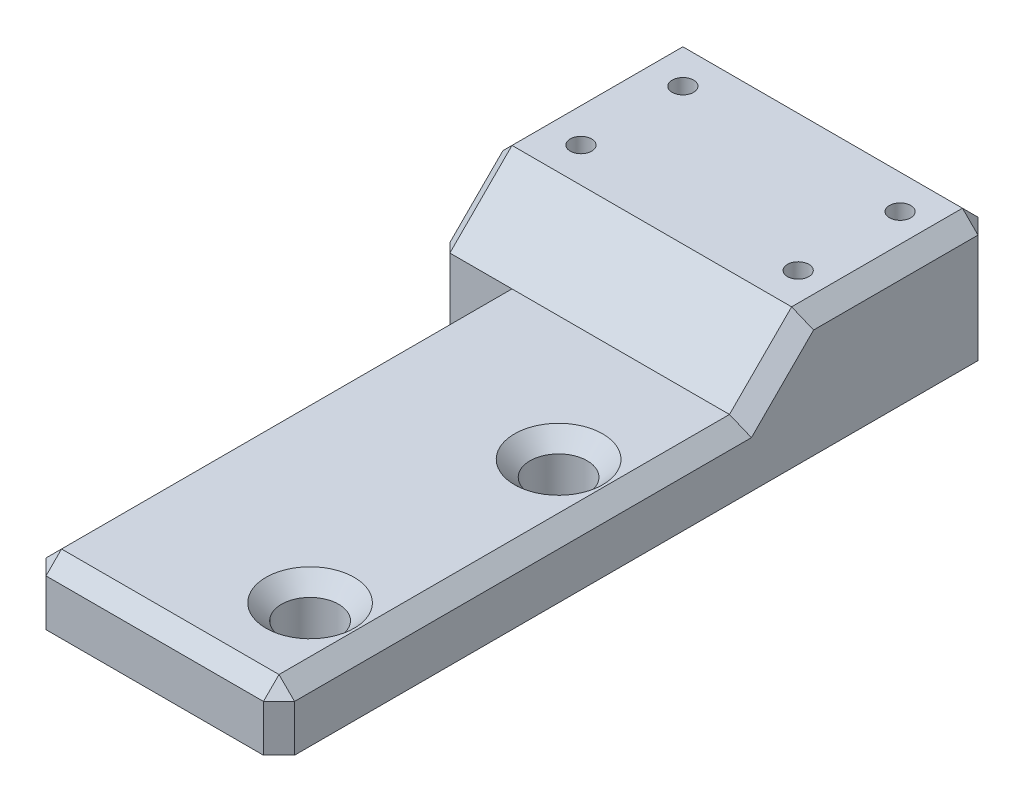
ISO-10303-21;
HEADER;
FILE_DESCRIPTION(('STEP AP214'),'2;1');
FILE_NAME('part.step','',(''),(''),'','','');
FILE_SCHEMA(('AUTOMOTIVE_DESIGN { 1 0 10303 214 1 1 1 1 }'));
ENDSEC;
DATA;
#1=APPLICATION_CONTEXT('core data for automotive mechanical design processes');
#2=APPLICATION_PROTOCOL_DEFINITION('international standard','automotive_design',2000,#1);
#3=PRODUCT_CONTEXT('',#1,'mechanical');
#4=PRODUCT('Part','Part','',(#3));
#5=PRODUCT_RELATED_PRODUCT_CATEGORY('part','',(#4));
#6=PRODUCT_DEFINITION_FORMATION('','',#4);
#7=PRODUCT_DEFINITION_CONTEXT('part definition',#1,'design');
#8=PRODUCT_DEFINITION('design','',#6,#7);
#9=PRODUCT_DEFINITION_SHAPE('','',#8);
#10=(LENGTH_UNIT() NAMED_UNIT(*) SI_UNIT(.MILLI.,.METRE.));
#11=(NAMED_UNIT(*) PLANE_ANGLE_UNIT() SI_UNIT($,.RADIAN.));
#12=(NAMED_UNIT(*) SI_UNIT($,.STERADIAN.) SOLID_ANGLE_UNIT());
#13=UNCERTAINTY_MEASURE_WITH_UNIT(LENGTH_MEASURE(1.E-05),#10,'distance_accuracy_value','');
#14=(GEOMETRIC_REPRESENTATION_CONTEXT(3) GLOBAL_UNCERTAINTY_ASSIGNED_CONTEXT((#13)) GLOBAL_UNIT_ASSIGNED_CONTEXT((#10,
#11,#12)) REPRESENTATION_CONTEXT('',''));
#15=CARTESIAN_POINT('',(0.,0.,0.));
#16=DIRECTION('',(0.,0.,1.));
#17=DIRECTION('',(1.,0.,0.));
#18=AXIS2_PLACEMENT_3D('',#15,#16,#17);
#19=CARTESIAN_POINT('',(0.,12.7,0.));
#20=DIRECTION('',(0.,-1.,0.));
#21=DIRECTION('',(0.,0.,-1.));
#22=AXIS2_PLACEMENT_3D('',#19,#20,#21);
#23=PLANE('',#22);
#24=CARTESIAN_POINT('',(5.08,12.7,-67.945));
#25=DIRECTION('',(0.,-1.,0.));
#26=DIRECTION('',(0.,0.,-1.));
#27=AXIS2_PLACEMENT_3D('',#24,#25,#26);
#28=CIRCLE('',#27,1.09219999999999);
#29=CARTESIAN_POINT('',(5.08,12.7,-69.0372));
#30=VERTEX_POINT('',#29);
#31=EDGE_CURVE('E203',#30,#30,#28,.T.);
#32=ORIENTED_EDGE('',*,*,#31,.T.);
#33=EDGE_LOOP('',(#32));
#34=FACE_BOUND('',#33,.T.);
#35=CARTESIAN_POINT('',(27.2796,12.7,-67.945));
#36=DIRECTION('',(0.,-1.,0.));
#37=DIRECTION('',(0.,0.,-1.));
#38=AXIS2_PLACEMENT_3D('',#35,#36,#37);
#39=CIRCLE('',#38,1.0922);
#40=CARTESIAN_POINT('',(27.2796,12.7,-69.0372));
#41=VERTEX_POINT('',#40);
#42=EDGE_CURVE('E182',#41,#41,#39,.T.);
#43=ORIENTED_EDGE('',*,*,#42,.T.);
#44=EDGE_LOOP('',(#43));
#45=FACE_BOUND('',#44,.T.);
#46=CARTESIAN_POINT('',(5.08,12.7,-57.531));
#47=DIRECTION('',(0.,-1.,0.));
#48=DIRECTION('',(0.,0.,-1.));
#49=AXIS2_PLACEMENT_3D('',#46,#47,#48);
#50=CIRCLE('',#49,1.0922);
#51=CARTESIAN_POINT('',(5.08,12.7,-58.6232));
#52=VERTEX_POINT('',#51);
#53=EDGE_CURVE('E409',#52,#52,#50,.T.);
#54=ORIENTED_EDGE('',*,*,#53,.T.);
#55=EDGE_LOOP('',(#54));
#56=FACE_BOUND('',#55,.T.);
#57=CARTESIAN_POINT('',(27.2796,12.7,-57.531));
#58=DIRECTION('',(0.,-1.,0.));
#59=DIRECTION('',(0.,0.,-1.));
#60=AXIS2_PLACEMENT_3D('',#57,#58,#59);
#61=CIRCLE('',#60,1.0922);
#62=CARTESIAN_POINT('',(27.2796,12.7,-58.6232));
#63=VERTEX_POINT('',#62);
#64=EDGE_CURVE('E194',#63,#63,#61,.T.);
#65=ORIENTED_EDGE('',*,*,#64,.T.);
#66=EDGE_LOOP('',(#65));
#67=FACE_BOUND('',#66,.T.);
#68=DIRECTION('',(1.,0.,0.));
#69=VECTOR('',#68,1.);
#70=CARTESIAN_POINT('',(0.,12.7,-53.975));
#71=LINE('',#70,#69);
#72=CARTESIAN_POINT('',(1.58750000000001,12.7,-53.975));
#73=VERTEX_POINT('',#72);
#74=CARTESIAN_POINT('',(30.1625,12.7,-53.975));
#75=VERTEX_POINT('',#74);
#76=EDGE_CURVE('E230',#73,#75,#71,.T.);
#77=ORIENTED_EDGE('',*,*,#76,.T.);
#78=DIRECTION('',(0.,0.,-1.));
#79=VECTOR('',#78,1.);
#80=CARTESIAN_POINT('',(30.1625,12.7,0.));
#81=LINE('',#80,#79);
#82=CARTESIAN_POINT('',(30.1625,12.7,-71.4375));
#83=VERTEX_POINT('',#82);
#84=EDGE_CURVE('E326',#75,#83,#81,.T.);
#85=ORIENTED_EDGE('',*,*,#84,.T.);
#86=DIRECTION('',(-1.,0.,0.));
#87=VECTOR('',#86,1.);
#88=CARTESIAN_POINT('',(0.,12.7,-71.4375));
#89=LINE('',#88,#87);
#90=CARTESIAN_POINT('',(1.58750000000001,12.7,-71.4375));
#91=VERTEX_POINT('',#90);
#92=EDGE_CURVE('E323',#83,#91,#89,.T.);
#93=ORIENTED_EDGE('',*,*,#92,.T.);
#94=DIRECTION('',(0.,0.,1.));
#95=VECTOR('',#94,1.);
#96=CARTESIAN_POINT('',(1.58750000000001,12.7,0.));
#97=LINE('',#96,#95);
#98=EDGE_CURVE('E320',#91,#73,#97,.T.);
#99=ORIENTED_EDGE('',*,*,#98,.T.);
#100=EDGE_LOOP('',(#77,#85,#93,#99));
#101=FACE_BOUND('',#100,.T.);
#102=ADVANCED_FACE('F41',(#34,#45,#56,#67,#101),#23,.F.);
#103=CARTESIAN_POINT('',(0.,0.,0.));
#104=DIRECTION('',(0.,-1.,0.));
#105=DIRECTION('',(0.,0.,-1.));
#106=AXIS2_PLACEMENT_3D('',#103,#104,#105);
#107=PLANE('',#106);
#108=CARTESIAN_POINT('',(5.08,0.,-67.945));
#109=DIRECTION('',(0.,-1.,0.));
#110=DIRECTION('',(0.,0.,-1.));
#111=AXIS2_PLACEMENT_3D('',#108,#109,#110);
#112=CIRCLE('',#111,1.09219999999999);
#113=CARTESIAN_POINT('',(5.08,0.,-69.0372));
#114=VERTEX_POINT('',#113);
#115=EDGE_CURVE('E173',#114,#114,#112,.T.);
#116=ORIENTED_EDGE('',*,*,#115,.F.);
#117=EDGE_LOOP('',(#116));
#118=FACE_BOUND('',#117,.T.);
#119=DIRECTION('',(-1.,0.,0.));
#120=VECTOR('',#119,1.);
#121=CARTESIAN_POINT('',(0.,0.,-73.025));
#122=LINE('',#121,#120);
#123=CARTESIAN_POINT('',(30.1625,0.,-73.025));
#124=VERTEX_POINT('',#123);
#125=CARTESIAN_POINT('',(1.58750000000001,0.,-73.025));
#126=VERTEX_POINT('',#125);
#127=EDGE_CURVE('E226',#124,#126,#122,.T.);
#128=ORIENTED_EDGE('',*,*,#127,.F.);
#129=DIRECTION('',(-0.707106781186543,0.,-0.707106781186552));
#130=VECTOR('',#129,1.);
#131=CARTESIAN_POINT('',(51.5937500000002,0.,-51.5937499999995));
#132=LINE('',#131,#130);
#133=CARTESIAN_POINT('',(31.75,0.,-71.4375));
#134=VERTEX_POINT('',#133);
#135=EDGE_CURVE('E282',#124,#134,#132,.F.);
#136=ORIENTED_EDGE('',*,*,#135,.T.);
#137=DIRECTION('',(0.,0.,-1.));
#138=VECTOR('',#137,1.);
#139=CARTESIAN_POINT('',(31.75,0.,0.));
#140=LINE('',#139,#138);
#141=CARTESIAN_POINT('',(31.75,0.,-1.5875));
#142=VERTEX_POINT('',#141);
#143=EDGE_CURVE('E222',#142,#134,#140,.T.);
#144=ORIENTED_EDGE('',*,*,#143,.F.);
#145=DIRECTION('',(0.707106781186551,0.,-0.707106781186544));
#146=VECTOR('',#145,1.);
#147=CARTESIAN_POINT('',(15.0812499999999,0.,15.08125));
#148=LINE('',#147,#146);
#149=CARTESIAN_POINT('',(30.1625,0.,0.));
#150=VERTEX_POINT('',#149);
#151=EDGE_CURVE('E279',#142,#150,#148,.F.);
#152=ORIENTED_EDGE('',*,*,#151,.T.);
#153=DIRECTION('',(1.,0.,0.));
#154=VECTOR('',#153,1.);
#155=CARTESIAN_POINT('',(0.,0.,0.));
#156=LINE('',#155,#154);
#157=CARTESIAN_POINT('',(7.9375,0.,0.));
#158=VERTEX_POINT('',#157);
#159=EDGE_CURVE('E218',#158,#150,#156,.T.);
#160=ORIENTED_EDGE('',*,*,#159,.F.);
#161=DIRECTION('',(0.707106781186544,0.,0.707106781186551));
#162=VECTOR('',#161,1.);
#163=CARTESIAN_POINT('',(3.96875000000003,0.,-3.96875));
#164=LINE('',#163,#162);
#165=CARTESIAN_POINT('',(6.35,0.,-1.58750000000001));
#166=VERTEX_POINT('',#165);
#167=EDGE_CURVE('E189',#158,#166,#164,.F.);
#168=ORIENTED_EDGE('',*,*,#167,.T.);
#169=DIRECTION('',(0.,0.,1.));
#170=VECTOR('',#169,1.);
#171=CARTESIAN_POINT('',(6.35,0.,0.));
#172=LINE('',#171,#170);
#173=CARTESIAN_POINT('',(6.35000000000001,0.,-47.625));
#174=VERTEX_POINT('',#173);
#175=EDGE_CURVE('E166',#174,#166,#172,.T.);
#176=ORIENTED_EDGE('',*,*,#175,.F.);
#177=DIRECTION('',(1.,0.,0.));
#178=VECTOR('',#177,1.);
#179=CARTESIAN_POINT('',(0.,0.,-47.625));
#180=LINE('',#179,#178);
#181=CARTESIAN_POINT('',(1.58750000000001,0.,-47.625));
#182=VERTEX_POINT('',#181);
#183=EDGE_CURVE('E176',#182,#174,#180,.T.);
#184=ORIENTED_EDGE('',*,*,#183,.F.);
#185=DIRECTION('',(0.707106781186551,0.,0.707106781186544));
#186=VECTOR('',#185,1.);
#187=CARTESIAN_POINT('',(24.60625,0.,-24.6062500000002));
#188=LINE('',#187,#186);
#189=CARTESIAN_POINT('',(0.,0.,-49.2125));
#190=VERTEX_POINT('',#189);
#191=EDGE_CURVE('E271',#182,#190,#188,.F.);
#192=ORIENTED_EDGE('',*,*,#191,.T.);
#193=DIRECTION('',(0.,0.,1.));
#194=VECTOR('',#193,1.);
#195=CARTESIAN_POINT('',(0.,0.,0.));
#196=LINE('',#195,#194);
#197=CARTESIAN_POINT('',(0.,0.,-71.4375));
#198=VERTEX_POINT('',#197);
#199=EDGE_CURVE('E214',#198,#190,#196,.T.);
#200=ORIENTED_EDGE('',*,*,#199,.F.);
#201=DIRECTION('',(-0.707106781186552,0.,0.707106781186543));
#202=VECTOR('',#201,1.);
#203=CARTESIAN_POINT('',(-35.71875,0.,-35.7187500000005));
#204=LINE('',#203,#202);
#205=EDGE_CURVE('E274',#198,#126,#204,.F.);
#206=ORIENTED_EDGE('',*,*,#205,.T.);
#207=EDGE_LOOP('',(#128,#136,#144,#152,#160,#168,#176,#184,#192,#200,#206));
#208=FACE_BOUND('',#207,.T.);
#209=CARTESIAN_POINT('',(27.2796,0.,-67.945));
#210=DIRECTION('',(0.,-1.,0.));
#211=DIRECTION('',(0.,0.,-1.));
#212=AXIS2_PLACEMENT_3D('',#209,#210,#211);
#213=CIRCLE('',#212,1.0922);
#214=CARTESIAN_POINT('',(27.2796,0.,-69.0372));
#215=VERTEX_POINT('',#214);
#216=EDGE_CURVE('E415',#215,#215,#213,.T.);
#217=ORIENTED_EDGE('',*,*,#216,.F.);
#218=EDGE_LOOP('',(#217));
#219=FACE_BOUND('',#218,.T.);
#220=CARTESIAN_POINT('',(5.08,0.,-57.531));
#221=DIRECTION('',(0.,-1.,0.));
#222=DIRECTION('',(0.,0.,-1.));
#223=AXIS2_PLACEMENT_3D('',#220,#221,#222);
#224=CIRCLE('',#223,1.0922);
#225=CARTESIAN_POINT('',(5.08,0.,-58.6232));
#226=VERTEX_POINT('',#225);
#227=EDGE_CURVE('E405',#226,#226,#224,.T.);
#228=ORIENTED_EDGE('',*,*,#227,.F.);
#229=EDGE_LOOP('',(#228));
#230=FACE_BOUND('',#229,.T.);
#231=CARTESIAN_POINT('',(27.2796,0.,-57.531));
#232=DIRECTION('',(0.,-1.,0.));
#233=DIRECTION('',(0.,0.,-1.));
#234=AXIS2_PLACEMENT_3D('',#231,#232,#233);
#235=CIRCLE('',#234,1.0922);
#236=CARTESIAN_POINT('',(27.2796,0.,-58.6232));
#237=VERTEX_POINT('',#236);
#238=EDGE_CURVE('E199',#237,#237,#235,.T.);
#239=ORIENTED_EDGE('',*,*,#238,.F.);
#240=EDGE_LOOP('',(#239));
#241=FACE_BOUND('',#240,.T.);
#242=CARTESIAN_POINT('',(25.4,0.,-9.525));
#243=DIRECTION('',(0.,1.,0.));
#244=DIRECTION('',(0.,0.,1.));
#245=AXIS2_PLACEMENT_3D('',#242,#243,#244);
#246=CIRCLE('',#245,2.921);
#247=CARTESIAN_POINT('',(25.4,0.,-6.604));
#248=VERTEX_POINT('',#247);
#249=EDGE_CURVE('E210',#248,#248,#246,.T.);
#250=ORIENTED_EDGE('',*,*,#249,.T.);
#251=EDGE_LOOP('',(#250));
#252=FACE_BOUND('',#251,.T.);
#253=CARTESIAN_POINT('',(25.4,0.,-34.925));
#254=DIRECTION('',(0.,1.,0.));
#255=DIRECTION('',(0.,0.,1.));
#256=AXIS2_PLACEMENT_3D('',#253,#254,#255);
#257=CIRCLE('',#256,2.921);
#258=CARTESIAN_POINT('',(25.4,0.,-32.004));
#259=VERTEX_POINT('',#258);
#260=EDGE_CURVE('E206',#259,#259,#257,.T.);
#261=ORIENTED_EDGE('',*,*,#260,.T.);
#262=EDGE_LOOP('',(#261));
#263=FACE_BOUND('',#262,.T.);
#264=ADVANCED_FACE('F185',(#118,#208,#219,#230,#241,#252,#263),#107,.T.);
#265=CARTESIAN_POINT('',(0.,12.7,0.));
#266=DIRECTION('',(1.,0.,0.));
#267=DIRECTION('',(0.,0.,-1.));
#268=AXIS2_PLACEMENT_3D('',#265,#266,#267);
#269=PLANE('',#268);
#270=DIRECTION('',(0.,0.,-1.));
#271=VECTOR('',#270,1.);
#272=CARTESIAN_POINT('',(0.,11.1125,0.));
#273=LINE('',#272,#271);
#274=CARTESIAN_POINT('',(0.,11.1125,-54.6325640302673));
#275=VERTEX_POINT('',#274);
#276=CARTESIAN_POINT('',(0.,11.1125,-71.4375));
#277=VERTEX_POINT('',#276);
#278=EDGE_CURVE('E68',#275,#277,#273,.T.);
#279=ORIENTED_EDGE('',*,*,#278,.T.);
#280=DIRECTION('',(0.,-1.,0.));
#281=VECTOR('',#280,1.);
#282=CARTESIAN_POINT('',(0.,12.7,-71.4375));
#283=LINE('',#282,#281);
#284=EDGE_CURVE('E337',#277,#198,#283,.T.);
#285=ORIENTED_EDGE('',*,*,#284,.T.);
#286=ORIENTED_EDGE('',*,*,#199,.T.);
#287=DIRECTION('',(0.,1.,0.));
#288=VECTOR('',#287,1.);
#289=CARTESIAN_POINT('',(0.,12.7,-49.2125));
#290=LINE('',#289,#288);
#291=CARTESIAN_POINT('',(0.,5.69243596973269,-49.2125));
#292=VERTEX_POINT('',#291);
#293=EDGE_CURVE('E329',#190,#292,#290,.T.);
#294=ORIENTED_EDGE('',*,*,#293,.T.);
#295=DIRECTION('',(0.,0.707106781186548,-0.707106781186547));
#296=VECTOR('',#295,1.);
#297=CARTESIAN_POINT('',(0.,11.5774679848664,-55.0975320151337));
#298=LINE('',#297,#296);
#299=EDGE_CURVE('E332',#292,#275,#298,.T.);
#300=ORIENTED_EDGE('',*,*,#299,.T.);
#301=EDGE_LOOP('',(#279,#285,#286,#294,#300));
#302=FACE_BOUND('',#301,.T.);
#303=ADVANCED_FACE('F428',(#302),#269,.F.);
#304=CARTESIAN_POINT('',(0.,12.7,0.));
#305=DIRECTION('',(0.,0.,-1.));
#306=DIRECTION('',(-1.,0.,0.));
#307=AXIS2_PLACEMENT_3D('',#304,#305,#306);
#308=PLANE('',#307);
#309=ORIENTED_EDGE('',*,*,#159,.T.);
#310=DIRECTION('',(0.,1.,0.));
#311=VECTOR('',#310,1.);
#312=CARTESIAN_POINT('',(30.1625,12.7,0.));
#313=LINE('',#312,#311);
#314=CARTESIAN_POINT('',(30.1625,4.76249999999999,0.));
#315=VERTEX_POINT('',#314);
#316=EDGE_CURVE('E306',#150,#315,#313,.T.);
#317=ORIENTED_EDGE('',*,*,#316,.T.);
#318=DIRECTION('',(-1.,0.,0.));
#319=VECTOR('',#318,1.);
#320=CARTESIAN_POINT('',(0.,4.76249999999999,0.));
#321=LINE('',#320,#319);
#322=CARTESIAN_POINT('',(7.9375,4.76249999999999,0.));
#323=VERTEX_POINT('',#322);
#324=EDGE_CURVE('E300',#315,#323,#321,.T.);
#325=ORIENTED_EDGE('',*,*,#324,.T.);
#326=DIRECTION('',(0.,-1.,0.));
#327=VECTOR('',#326,1.);
#328=CARTESIAN_POINT('',(7.9375,12.7,0.));
#329=LINE('',#328,#327);
#330=EDGE_CURVE('E303',#323,#158,#329,.T.);
#331=ORIENTED_EDGE('',*,*,#330,.T.);
#332=EDGE_LOOP('',(#309,#317,#325,#331));
#333=FACE_BOUND('',#332,.T.);
#334=ADVANCED_FACE('F434',(#333),#308,.F.);
#335=CARTESIAN_POINT('',(31.75,12.7,0.));
#336=DIRECTION('',(-1.,0.,0.));
#337=DIRECTION('',(0.,0.,1.));
#338=AXIS2_PLACEMENT_3D('',#335,#336,#337);
#339=PLANE('',#338);
#340=ORIENTED_EDGE('',*,*,#143,.T.);
#341=DIRECTION('',(0.,1.,0.));
#342=VECTOR('',#341,1.);
#343=CARTESIAN_POINT('',(31.75,12.7,-71.4375));
#344=LINE('',#343,#342);
#345=CARTESIAN_POINT('',(31.75,11.1125,-71.4375));
#346=VERTEX_POINT('',#345);
#347=EDGE_CURVE('E297',#134,#346,#344,.T.);
#348=ORIENTED_EDGE('',*,*,#347,.T.);
#349=DIRECTION('',(0.,0.,1.));
#350=VECTOR('',#349,1.);
#351=CARTESIAN_POINT('',(31.75,11.1125,0.));
#352=LINE('',#351,#350);
#353=CARTESIAN_POINT('',(31.75,11.1125,-54.6325640302673));
#354=VERTEX_POINT('',#353);
#355=EDGE_CURVE('E285',#346,#354,#352,.T.);
#356=ORIENTED_EDGE('',*,*,#355,.T.);
#357=DIRECTION('',(0.,-0.707106781186548,0.707106781186547));
#358=VECTOR('',#357,1.);
#359=CARTESIAN_POINT('',(31.75,5.22746798486635,-48.7475320151337));
#360=LINE('',#359,#358);
#361=CARTESIAN_POINT('',(31.75,4.76249999999999,-48.2825640302673));
#362=VERTEX_POINT('',#361);
#363=EDGE_CURVE('E288',#354,#362,#360,.T.);
#364=ORIENTED_EDGE('',*,*,#363,.T.);
#365=DIRECTION('',(0.,0.,1.));
#366=VECTOR('',#365,1.);
#367=CARTESIAN_POINT('',(31.75,4.76249999999999,0.));
#368=LINE('',#367,#366);
#369=CARTESIAN_POINT('',(31.75,4.76249999999999,-1.5875));
#370=VERTEX_POINT('',#369);
#371=EDGE_CURVE('E291',#362,#370,#368,.T.);
#372=ORIENTED_EDGE('',*,*,#371,.T.);
#373=DIRECTION('',(0.,-1.,0.));
#374=VECTOR('',#373,1.);
#375=CARTESIAN_POINT('',(31.75,12.7,-1.5875));
#376=LINE('',#375,#374);
#377=EDGE_CURVE('E294',#370,#142,#376,.T.);
#378=ORIENTED_EDGE('',*,*,#377,.T.);
#379=EDGE_LOOP('',(#340,#348,#356,#364,#372,#378));
#380=FACE_BOUND('',#379,.T.);
#381=ADVANCED_FACE('F444',(#380),#339,.F.);
#382=CARTESIAN_POINT('',(0.,12.7,-73.025));
#383=DIRECTION('',(0.,0.,1.));
#384=DIRECTION('',(1.,0.,0.));
#385=AXIS2_PLACEMENT_3D('',#382,#383,#384);
#386=PLANE('',#385);
#387=DIRECTION('',(1.,0.,0.));
#388=VECTOR('',#387,1.);
#389=CARTESIAN_POINT('',(0.,11.1125,-73.025));
#390=LINE('',#389,#388);
#391=CARTESIAN_POINT('',(1.58750000000001,11.1125,-73.025));
#392=VERTEX_POINT('',#391);
#393=CARTESIAN_POINT('',(30.1625,11.1125,-73.025));
#394=VERTEX_POINT('',#393);
#395=EDGE_CURVE('E261',#392,#394,#390,.T.);
#396=ORIENTED_EDGE('',*,*,#395,.T.);
#397=DIRECTION('',(0.,-1.,0.));
#398=VECTOR('',#397,1.);
#399=CARTESIAN_POINT('',(30.1625,12.7,-73.025));
#400=LINE('',#399,#398);
#401=EDGE_CURVE('E267',#394,#124,#400,.T.);
#402=ORIENTED_EDGE('',*,*,#401,.T.);
#403=ORIENTED_EDGE('',*,*,#127,.T.);
#404=DIRECTION('',(0.,1.,0.));
#405=VECTOR('',#404,1.);
#406=CARTESIAN_POINT('',(1.58750000000001,12.7,-73.025));
#407=LINE('',#406,#405);
#408=EDGE_CURVE('E264',#126,#392,#407,.T.);
#409=ORIENTED_EDGE('',*,*,#408,.T.);
#410=EDGE_LOOP('',(#396,#402,#403,#409));
#411=FACE_BOUND('',#410,.T.);
#412=ADVANCED_FACE('F440',(#411),#386,.F.);
#413=CARTESIAN_POINT('',(25.4,12.7,-9.525));
#414=DIRECTION('',(0.,-1.,0.));
#415=DIRECTION('',(0.,0.,-1.));
#416=AXIS2_PLACEMENT_3D('',#413,#414,#415);
#417=CYLINDRICAL_SURFACE('',#416,2.921);
#418=CARTESIAN_POINT('',(25.4,4.7625,-9.525));
#419=DIRECTION('',(0.,-1.,0.));
#420=DIRECTION('',(0.,0.,-1.));
#421=AXIS2_PLACEMENT_3D('',#418,#419,#420);
#422=CIRCLE('',#421,2.921);
#423=CARTESIAN_POINT('',(25.4,4.7625,-6.604));
#424=VERTEX_POINT('',#423);
#425=EDGE_CURVE('E253',#424,#424,#422,.F.);
#426=ORIENTED_EDGE('',*,*,#425,.T.);
#427=EDGE_LOOP('',(#426));
#428=FACE_BOUND('',#427,.T.);
#429=ORIENTED_EDGE('',*,*,#249,.F.);
#430=EDGE_LOOP('',(#429));
#431=FACE_BOUND('',#430,.T.);
#432=ADVANCED_FACE('F443',(#428,#431),#417,.F.);
#433=CARTESIAN_POINT('',(25.4,12.7,-34.925));
#434=DIRECTION('',(0.,-1.,0.));
#435=DIRECTION('',(0.,0.,-1.));
#436=AXIS2_PLACEMENT_3D('',#433,#434,#435);
#437=CYLINDRICAL_SURFACE('',#436,2.921);
#438=CARTESIAN_POINT('',(25.4,4.7625,-34.925));
#439=DIRECTION('',(0.,-1.,0.));
#440=DIRECTION('',(0.,0.,-1.));
#441=AXIS2_PLACEMENT_3D('',#438,#439,#440);
#442=CIRCLE('',#441,2.921);
#443=CARTESIAN_POINT('',(25.4,4.7625,-37.846));
#444=VERTEX_POINT('',#443);
#445=EDGE_CURVE('E257',#444,#444,#442,.F.);
#446=ORIENTED_EDGE('',*,*,#445,.T.);
#447=EDGE_LOOP('',(#446));
#448=FACE_BOUND('',#447,.T.);
#449=ORIENTED_EDGE('',*,*,#260,.F.);
#450=EDGE_LOOP('',(#449));
#451=FACE_BOUND('',#450,.T.);
#452=ADVANCED_FACE('F636',(#448,#451),#437,.F.);
#453=CARTESIAN_POINT('',(0.,12.7,-47.625));
#454=DIRECTION('',(0.,0.,-1.));
#455=DIRECTION('',(-1.,0.,0.));
#456=AXIS2_PLACEMENT_3D('',#453,#454,#455);
#457=PLANE('',#456);
#458=DIRECTION('',(-1.,0.,0.));
#459=VECTOR('',#458,1.);
#460=CARTESIAN_POINT('',(0.,6.34999999999998,-47.625));
#461=LINE('',#460,#459);
#462=CARTESIAN_POINT('',(7.93750000000001,6.35,-47.625));
#463=VERTEX_POINT('',#462);
#464=CARTESIAN_POINT('',(1.58750000000001,6.34999999999998,-47.625));
#465=VERTEX_POINT('',#464);
#466=EDGE_CURVE('E60',#463,#465,#461,.T.);
#467=ORIENTED_EDGE('',*,*,#466,.T.);
#468=DIRECTION('',(0.,-1.,0.));
#469=VECTOR('',#468,1.);
#470=CARTESIAN_POINT('',(1.58750000000001,12.7,-47.625));
#471=LINE('',#470,#469);
#472=EDGE_CURVE('E52',#465,#182,#471,.T.);
#473=ORIENTED_EDGE('',*,*,#472,.T.);
#474=ORIENTED_EDGE('',*,*,#183,.T.);
#475=DIRECTION('',(0.,-1.,0.));
#476=VECTOR('',#475,1.);
#477=CARTESIAN_POINT('',(6.35000000000001,12.7,-47.625));
#478=LINE('',#477,#476);
#479=CARTESIAN_POINT('',(6.35000000000001,4.76249999999999,-47.625));
#480=VERTEX_POINT('',#479);
#481=EDGE_CURVE('E162',#480,#174,#478,.T.);
#482=ORIENTED_EDGE('',*,*,#481,.F.);
#483=DIRECTION('',(-0.707106781186544,-0.707106781186551,0.));
#484=VECTOR('',#483,1.);
#485=CARTESIAN_POINT('',(7.14375000000004,5.55625000000003,-47.625));
#486=LINE('',#485,#484);
#487=EDGE_CURVE('E11',#480,#463,#486,.F.);
#488=ORIENTED_EDGE('',*,*,#487,.T.);
#489=EDGE_LOOP('',(#467,#473,#474,#482,#488));
#490=FACE_BOUND('',#489,.T.);
#491=ADVANCED_FACE('F177',(#490),#457,.F.);
#492=CARTESIAN_POINT('',(0.,6.35,0.));
#493=DIRECTION('',(0.,-1.,0.));
#494=DIRECTION('',(0.,0.,-1.));
#495=AXIS2_PLACEMENT_3D('',#492,#493,#494);
#496=PLANE('',#495);
#497=CARTESIAN_POINT('',(25.4,6.35,-9.525));
#498=DIRECTION('',(0.,-1.,0.));
#499=DIRECTION('',(0.,0.,-1.));
#500=AXIS2_PLACEMENT_3D('',#497,#498,#499);
#501=CIRCLE('',#500,4.50849999999999);
#502=CARTESIAN_POINT('',(25.4,6.35,-5.01650000000001));
#503=VERTEX_POINT('',#502);
#504=EDGE_CURVE('E249',#503,#503,#501,.T.);
#505=ORIENTED_EDGE('',*,*,#504,.T.);
#506=EDGE_LOOP('',(#505));
#507=FACE_BOUND('',#506,.T.);
#508=CARTESIAN_POINT('',(25.4,6.35,-34.925));
#509=DIRECTION('',(0.,-1.,0.));
#510=DIRECTION('',(0.,0.,-1.));
#511=AXIS2_PLACEMENT_3D('',#508,#509,#510);
#512=CIRCLE('',#511,4.5085);
#513=CARTESIAN_POINT('',(25.4,6.35,-39.4335));
#514=VERTEX_POINT('',#513);
#515=EDGE_CURVE('E245',#514,#514,#512,.T.);
#516=ORIENTED_EDGE('',*,*,#515,.T.);
#517=EDGE_LOOP('',(#516));
#518=FACE_BOUND('',#517,.T.);
#519=DIRECTION('',(1.,0.,0.));
#520=VECTOR('',#519,1.);
#521=CARTESIAN_POINT('',(0.,6.35,-47.625));
#522=LINE('',#521,#520);
#523=CARTESIAN_POINT('',(30.1625,6.35,-47.625));
#524=VERTEX_POINT('',#523);
#525=EDGE_CURVE('E198',#463,#524,#522,.T.);
#526=ORIENTED_EDGE('',*,*,#525,.F.);
#527=DIRECTION('',(0.,0.,1.));
#528=VECTOR('',#527,1.);
#529=CARTESIAN_POINT('',(7.9375,6.35,0.));
#530=LINE('',#529,#528);
#531=CARTESIAN_POINT('',(7.9375,6.35,-1.5875));
#532=VERTEX_POINT('',#531);
#533=EDGE_CURVE('E242',#463,#532,#530,.T.);
#534=ORIENTED_EDGE('',*,*,#533,.T.);
#535=DIRECTION('',(1.,0.,0.));
#536=VECTOR('',#535,1.);
#537=CARTESIAN_POINT('',(0.,6.35,-1.5875));
#538=LINE('',#537,#536);
#539=CARTESIAN_POINT('',(30.1625,6.35,-1.5875));
#540=VERTEX_POINT('',#539);
#541=EDGE_CURVE('E239',#532,#540,#538,.T.);
#542=ORIENTED_EDGE('',*,*,#541,.T.);
#543=DIRECTION('',(0.,0.,-1.));
#544=VECTOR('',#543,1.);
#545=CARTESIAN_POINT('',(30.1625,6.35,0.));
#546=LINE('',#545,#544);
#547=EDGE_CURVE('E236',#540,#524,#546,.T.);
#548=ORIENTED_EDGE('',*,*,#547,.T.);
#549=EDGE_LOOP('',(#526,#534,#542,#548));
#550=FACE_BOUND('',#549,.T.);
#551=ADVANCED_FACE('F622',(#507,#518,#550),#496,.F.);
#552=CARTESIAN_POINT('',(6.35,12.7,0.));
#553=DIRECTION('',(1.,0.,0.));
#554=DIRECTION('',(0.,0.,-1.));
#555=AXIS2_PLACEMENT_3D('',#552,#553,#554);
#556=PLANE('',#555);
#557=ORIENTED_EDGE('',*,*,#175,.T.);
#558=DIRECTION('',(0.,1.,0.));
#559=VECTOR('',#558,1.);
#560=CARTESIAN_POINT('',(6.35,12.7,-1.58750000000001));
#561=LINE('',#560,#559);
#562=CARTESIAN_POINT('',(6.35,4.76249999999999,-1.58750000000001));
#563=VERTEX_POINT('',#562);
#564=EDGE_CURVE('E311',#166,#563,#561,.T.);
#565=ORIENTED_EDGE('',*,*,#564,.T.);
#566=DIRECTION('',(0.,0.,-1.));
#567=VECTOR('',#566,1.);
#568=CARTESIAN_POINT('',(6.35,4.76249999999999,0.));
#569=LINE('',#568,#567);
#570=EDGE_CURVE('E169',#563,#480,#569,.T.);
#571=ORIENTED_EDGE('',*,*,#570,.T.);
#572=ORIENTED_EDGE('',*,*,#481,.T.);
#573=EDGE_LOOP('',(#557,#565,#571,#572));
#574=FACE_BOUND('',#573,.T.);
#575=ADVANCED_FACE('F164',(#574),#556,.F.);
#576=CARTESIAN_POINT('',(27.2796,12.7,-57.531));
#577=DIRECTION('',(0.,-1.,0.));
#578=DIRECTION('',(0.,0.,-1.));
#579=AXIS2_PLACEMENT_3D('',#576,#577,#578);
#580=CYLINDRICAL_SURFACE('',#579,1.0922);
#581=ORIENTED_EDGE('',*,*,#64,.F.);
#582=EDGE_LOOP('',(#581));
#583=FACE_BOUND('',#582,.T.);
#584=ORIENTED_EDGE('',*,*,#238,.T.);
#585=EDGE_LOOP('',(#584));
#586=FACE_BOUND('',#585,.T.);
#587=ADVANCED_FACE('F634',(#583,#586),#580,.F.);
#588=CARTESIAN_POINT('',(5.08,12.7,-57.531));
#589=DIRECTION('',(0.,-1.,0.));
#590=DIRECTION('',(0.,0.,-1.));
#591=AXIS2_PLACEMENT_3D('',#588,#589,#590);
#592=CYLINDRICAL_SURFACE('',#591,1.0922);
#593=ORIENTED_EDGE('',*,*,#53,.F.);
#594=EDGE_LOOP('',(#593));
#595=FACE_BOUND('',#594,.T.);
#596=ORIENTED_EDGE('',*,*,#227,.T.);
#597=EDGE_LOOP('',(#596));
#598=FACE_BOUND('',#597,.T.);
#599=ADVANCED_FACE('F814',(#595,#598),#592,.F.);
#600=CARTESIAN_POINT('',(27.2796,12.7,-67.945));
#601=DIRECTION('',(0.,-1.,0.));
#602=DIRECTION('',(0.,0.,-1.));
#603=AXIS2_PLACEMENT_3D('',#600,#601,#602);
#604=CYLINDRICAL_SURFACE('',#603,1.0922);
#605=ORIENTED_EDGE('',*,*,#42,.F.);
#606=EDGE_LOOP('',(#605));
#607=FACE_BOUND('',#606,.T.);
#608=ORIENTED_EDGE('',*,*,#216,.T.);
#609=EDGE_LOOP('',(#608));
#610=FACE_BOUND('',#609,.T.);
#611=ADVANCED_FACE('F806',(#607,#610),#604,.F.);
#612=CARTESIAN_POINT('',(5.08,12.7,-67.945));
#613=DIRECTION('',(0.,-1.,0.));
#614=DIRECTION('',(0.,0.,-1.));
#615=AXIS2_PLACEMENT_3D('',#612,#613,#614);
#616=CYLINDRICAL_SURFACE('',#615,1.09219999999999);
#617=ORIENTED_EDGE('',*,*,#31,.F.);
#618=EDGE_LOOP('',(#617));
#619=FACE_BOUND('',#618,.T.);
#620=ORIENTED_EDGE('',*,*,#115,.T.);
#621=EDGE_LOOP('',(#620));
#622=FACE_BOUND('',#621,.T.);
#623=ADVANCED_FACE('F425',(#619,#622),#616,.F.);
#624=CARTESIAN_POINT('',(0.,12.7,-53.975));
#625=DIRECTION('',(0.,-0.707106781186547,-0.707106781186548));
#626=DIRECTION('',(1.,0.,0.));
#627=AXIS2_PLACEMENT_3D('',#624,#625,#626);
#628=PLANE('',#627);
#629=ORIENTED_EDGE('',*,*,#525,.T.);
#630=DIRECTION('',(0.,-0.707106781186548,0.707106781186547));
#631=VECTOR('',#630,1.);
#632=CARTESIAN_POINT('',(30.1625,12.7,-53.975));
#633=LINE('',#632,#631);
#634=EDGE_CURVE('E317',#524,#75,#633,.F.);
#635=ORIENTED_EDGE('',*,*,#634,.T.);
#636=ORIENTED_EDGE('',*,*,#76,.F.);
#637=DIRECTION('',(0.,0.707106781186548,-0.707106781186547));
#638=VECTOR('',#637,1.);
#639=CARTESIAN_POINT('',(1.58750000000001,6.34999999999999,-47.625));
#640=LINE('',#639,#638);
#641=EDGE_CURVE('E314',#73,#465,#640,.F.);
#642=ORIENTED_EDGE('',*,*,#641,.T.);
#643=ORIENTED_EDGE('',*,*,#466,.F.);
#644=EDGE_LOOP('',(#629,#635,#636,#642,#643));
#645=FACE_BOUND('',#644,.T.);
#646=ADVANCED_FACE('F453',(#645),#628,.F.);
#647=CARTESIAN_POINT('',(25.4,6.35,-9.525));
#648=DIRECTION('',(0.,1.,0.));
#649=DIRECTION('',(0.,0.,1.));
#650=AXIS2_PLACEMENT_3D('',#647,#648,#649);
#651=CONICAL_SURFACE('',#650,4.50849999999999,0.785398163397444);
#652=CARTESIAN_POINT('',(25.4,4.7625,-6.604));
#653=CARTESIAN_POINT('',(25.4,4.77903645833333,-6.58746354166667));
#654=CARTESIAN_POINT('',(25.4,4.79557291666666,-6.57092708333333));
#655=CARTESIAN_POINT('',(25.4,4.82864583333333,-6.53785416666667));
#656=CARTESIAN_POINT('',(25.4,4.84518229166666,-6.52131770833333));
#657=CARTESIAN_POINT('',(25.4,4.87825520833333,-6.48824479166667));
#658=CARTESIAN_POINT('',(25.4,4.89479166666666,-6.47170833333333));
#659=CARTESIAN_POINT('',(25.4,4.92786458333333,-6.43863541666667));
#660=CARTESIAN_POINT('',(25.4,4.94440104166666,-6.42209895833333));
#661=CARTESIAN_POINT('',(25.4,4.97747395833333,-6.38902604166667));
#662=CARTESIAN_POINT('',(25.4,4.99401041666666,-6.37248958333333));
#663=CARTESIAN_POINT('',(25.4,5.02708333333333,-6.33941666666667));
#664=CARTESIAN_POINT('',(25.4,5.04361979166666,-6.32288020833333));
#665=CARTESIAN_POINT('',(25.4,5.07669270833333,-6.28980729166667));
#666=CARTESIAN_POINT('',(25.4,5.09322916666666,-6.27327083333333));
#667=CARTESIAN_POINT('',(25.4,5.12630208333333,-6.24019791666667));
#668=CARTESIAN_POINT('',(25.4,5.14283854166666,-6.22366145833333));
#669=CARTESIAN_POINT('',(25.4,5.17591145833333,-6.19058854166667));
#670=CARTESIAN_POINT('',(25.4,5.19244791666666,-6.17405208333334));
#671=CARTESIAN_POINT('',(25.4,5.22552083333333,-6.14097916666667));
#672=CARTESIAN_POINT('',(25.4,5.24205729166666,-6.12444270833334));
#673=CARTESIAN_POINT('',(25.4,5.27513020833333,-6.09136979166667));
#674=CARTESIAN_POINT('',(25.4,5.29166666666666,-6.07483333333334));
#675=CARTESIAN_POINT('',(25.4,5.32473958333333,-6.04176041666667));
#676=CARTESIAN_POINT('',(25.4,5.34127604166666,-6.02522395833334));
#677=CARTESIAN_POINT('',(25.4,5.37434895833333,-5.99215104166667));
#678=CARTESIAN_POINT('',(25.4,5.39088541666666,-5.97561458333334));
#679=CARTESIAN_POINT('',(25.4,5.42395833333333,-5.94254166666667));
#680=CARTESIAN_POINT('',(25.4,5.44049479166666,-5.92600520833334));
#681=CARTESIAN_POINT('',(25.4,5.47356770833333,-5.89293229166667));
#682=CARTESIAN_POINT('',(25.4,5.49010416666667,-5.87639583333334));
#683=CARTESIAN_POINT('',(25.4,5.52317708333333,-5.84332291666667));
#684=CARTESIAN_POINT('',(25.4,5.53971354166667,-5.82678645833334));
#685=CARTESIAN_POINT('',(25.4,5.57278645833333,-5.79371354166667));
#686=CARTESIAN_POINT('',(25.4,5.58932291666667,-5.77717708333334));
#687=CARTESIAN_POINT('',(25.4,5.62239583333333,-5.74410416666667));
#688=CARTESIAN_POINT('',(25.4,5.63893229166666,-5.72756770833334));
#689=CARTESIAN_POINT('',(25.4,5.67200520833333,-5.69449479166667));
#690=CARTESIAN_POINT('',(25.4,5.68854166666667,-5.67795833333334));
#691=CARTESIAN_POINT('',(25.4,5.72161458333333,-5.64488541666667));
#692=CARTESIAN_POINT('',(25.4,5.73815104166667,-5.62834895833334));
#693=CARTESIAN_POINT('',(25.4,5.77122395833333,-5.59527604166667));
#694=CARTESIAN_POINT('',(25.4,5.78776041666667,-5.57873958333334));
#695=CARTESIAN_POINT('',(25.4,5.82083333333333,-5.54566666666667));
#696=CARTESIAN_POINT('',(25.4,5.83736979166667,-5.52913020833334));
#697=CARTESIAN_POINT('',(25.4,5.87044270833333,-5.49605729166667));
#698=CARTESIAN_POINT('',(25.4,5.88697916666667,-5.47952083333334));
#699=CARTESIAN_POINT('',(25.4,5.92005208333333,-5.44644791666667));
#700=CARTESIAN_POINT('',(25.4,5.93658854166667,-5.42991145833334));
#701=CARTESIAN_POINT('',(25.4,5.96966145833333,-5.39683854166667));
#702=CARTESIAN_POINT('',(25.4,5.98619791666667,-5.38030208333334));
#703=CARTESIAN_POINT('',(25.4,6.01927083333333,-5.34722916666667));
#704=CARTESIAN_POINT('',(25.4,6.03580729166667,-5.33069270833334));
#705=CARTESIAN_POINT('',(25.4,6.06888020833333,-5.29761979166667));
#706=CARTESIAN_POINT('',(25.4,6.08541666666667,-5.28108333333334));
#707=CARTESIAN_POINT('',(25.4,6.11848958333333,-5.24801041666667));
#708=CARTESIAN_POINT('',(25.4,6.13502604166667,-5.23147395833334));
#709=CARTESIAN_POINT('',(25.4,6.16809895833333,-5.19840104166667));
#710=CARTESIAN_POINT('',(25.4,6.18463541666667,-5.18186458333334));
#711=CARTESIAN_POINT('',(25.4,6.21770833333333,-5.14879166666667));
#712=CARTESIAN_POINT('',(25.4,6.23424479166667,-5.13225520833334));
#713=CARTESIAN_POINT('',(25.4,6.26731770833333,-5.09918229166667));
#714=CARTESIAN_POINT('',(25.4,6.28385416666667,-5.08264583333334));
#715=CARTESIAN_POINT('',(25.4,6.31692708333333,-5.04957291666668));
#716=CARTESIAN_POINT('',(25.4,6.33346354166667,-5.03303645833334));
#717=CARTESIAN_POINT('',(25.4,6.35,-5.01650000000001));
#718=B_SPLINE_CURVE_WITH_KNOTS('',3,(#652,#653,#654,#655,#656,#657,#658,#659,#660,#661,#662,
#663,#664,#665,#666,#667,#668,#669,#670,#671,#672,#673,#674,#675,#676,#677,#678,#679,#680,#681,
#682,#683,#684,#685,#686,#687,#688,#689,#690,#691,#692,#693,#694,#695,#696,#697,#698,#699,#700,
#701,#702,#703,#704,#705,#706,#707,#708,#709,#710,#711,#712,#713,#714,#715,#716,#717),
.UNSPECIFIED.,.F.,.F.,(4,2,2,2,2,2,2,2,2,2,2,2,2,2,2,2,2,2,2,2,2,2,2,2,2,2,2,2,2,2,2,2,4),(0.,
0.0701582509458524,0.140316501891705,0.210474752837558,0.28063300378341,0.350791254729263,
0.420949505675116,0.491107756620969,0.561266007566821,0.631424258512674,0.701582509458526,
0.771740760404379,0.841899011350232,0.912057262296084,0.982215513241937,1.05237376418779,
1.12253201513364,1.1926902660795,1.26284851702535,1.3330067679712,1.40316501891705,
1.47332326986291,1.54348152080876,1.61363977175461,1.68379802270046,1.75395627364632,
1.82411452459217,1.89427277553802,1.96443102648387,2.03458927742973,2.10474752837558,
2.17490577932143,2.24506403026728),.UNSPECIFIED.);
#719=EDGE_CURVE('BSEAM459',#424,#503,#718,.T.);
#720=ORIENTED_EDGE('',*,*,#425,.F.);
#721=ORIENTED_EDGE('',*,*,#504,.F.);
#722=ORIENTED_EDGE('',*,*,#719,.T.);
#723=ORIENTED_EDGE('',*,*,#719,.F.);
#724=EDGE_LOOP('',(#720,#722,#721,#723));
#725=FACE_BOUND('',#724,.T.);
#726=ADVANCED_FACE('F459',(#725),#651,.F.);
#727=CARTESIAN_POINT('',(25.4,6.35,-34.925));
#728=DIRECTION('',(0.,1.,0.));
#729=DIRECTION('',(0.,0.,1.));
#730=AXIS2_PLACEMENT_3D('',#727,#728,#729);
#731=CONICAL_SURFACE('',#730,4.5085,0.785398163397446);
#732=ORIENTED_EDGE('',*,*,#445,.F.);
#733=EDGE_LOOP('',(#732));
#734=FACE_BOUND('',#733,.T.);
#735=ORIENTED_EDGE('',*,*,#515,.F.);
#736=EDGE_LOOP('',(#735));
#737=FACE_BOUND('',#736,.T.);
#738=ADVANCED_FACE('F465',(#734,#737),#731,.F.);
#739=CARTESIAN_POINT('',(7.9375,12.7,0.));
#740=DIRECTION('',(0.707106781186551,0.,-0.707106781186544));
#741=DIRECTION('',(0.,-1.,0.));
#742=AXIS2_PLACEMENT_3D('',#739,#740,#741);
#743=PLANE('',#742);
#744=ORIENTED_EDGE('',*,*,#167,.F.);
#745=ORIENTED_EDGE('',*,*,#330,.F.);
#746=DIRECTION('',(-0.707106781186544,0.,-0.707106781186551));
#747=VECTOR('',#746,1.);
#748=CARTESIAN_POINT('',(6.35,4.76249999999999,-1.58750000000001));
#749=LINE('',#748,#747);
#750=EDGE_CURVE('E46',#563,#323,#749,.F.);
#751=ORIENTED_EDGE('',*,*,#750,.F.);
#752=ORIENTED_EDGE('',*,*,#564,.F.);
#753=EDGE_LOOP('',(#744,#745,#751,#752));
#754=FACE_BOUND('',#753,.T.);
#755=ADVANCED_FACE('F44',(#754),#743,.F.);
#756=CARTESIAN_POINT('',(7.9375,6.35,0.));
#757=DIRECTION('',(0.707106781186551,-0.707106781186544,0.));
#758=DIRECTION('',(0.,0.,1.));
#759=AXIS2_PLACEMENT_3D('',#756,#757,#758);
#760=PLANE('',#759);
#761=ORIENTED_EDGE('',*,*,#487,.F.);
#762=ORIENTED_EDGE('',*,*,#570,.F.);
#763=DIRECTION('',(0.707106781186544,0.707106781186551,0.));
#764=VECTOR('',#763,1.);
#765=CARTESIAN_POINT('',(6.35,4.76249999999999,-1.58750000000001));
#766=LINE('',#765,#764);
#767=EDGE_CURVE('E397',#532,#563,#766,.F.);
#768=ORIENTED_EDGE('',*,*,#767,.F.);
#769=ORIENTED_EDGE('',*,*,#533,.F.);
#770=EDGE_LOOP('',(#761,#762,#768,#769));
#771=FACE_BOUND('',#770,.T.);
#772=ADVANCED_FACE('F576',(#771),#760,.F.);
#773=CARTESIAN_POINT('',(6.35,4.76249999999999,-1.58750000000001));
#774=DIRECTION('',(-0.577350269189631,0.577350269189621,0.577350269189626));
#775=DIRECTION('',(0.707106781186544,0.,0.707106781186551));
#776=AXIS2_PLACEMENT_3D('',#773,#774,#775);
#777=PLANE('',#776);
#778=ORIENTED_EDGE('',*,*,#767,.T.);
#779=ORIENTED_EDGE('',*,*,#750,.T.);
#780=DIRECTION('',(0.,-0.707106781186551,0.707106781186544));
#781=VECTOR('',#780,1.);
#782=CARTESIAN_POINT('',(7.9375,5.55624999999999,-0.793749999999999));
#783=LINE('',#782,#781);
#784=EDGE_CURVE('E394',#532,#323,#783,.T.);
#785=ORIENTED_EDGE('',*,*,#784,.F.);
#786=EDGE_LOOP('',(#778,#779,#785));
#787=FACE_BOUND('',#786,.T.);
#788=ADVANCED_FACE('F570',(#787),#777,.T.);
#789=CARTESIAN_POINT('',(31.75,12.7,-1.5875));
#790=DIRECTION('',(-0.707106781186544,0.,-0.707106781186551));
#791=DIRECTION('',(0.,-1.,0.));
#792=AXIS2_PLACEMENT_3D('',#789,#790,#791);
#793=PLANE('',#792);
#794=ORIENTED_EDGE('',*,*,#151,.F.);
#795=ORIENTED_EDGE('',*,*,#377,.F.);
#796=DIRECTION('',(-0.707106781186551,0.,0.707106781186544));
#797=VECTOR('',#796,1.);
#798=CARTESIAN_POINT('',(30.1625,4.76249999999999,0.));
#799=LINE('',#798,#797);
#800=EDGE_CURVE('E390',#315,#370,#799,.F.);
#801=ORIENTED_EDGE('',*,*,#800,.F.);
#802=ORIENTED_EDGE('',*,*,#316,.F.);
#803=EDGE_LOOP('',(#794,#795,#801,#802));
#804=FACE_BOUND('',#803,.T.);
#805=ADVANCED_FACE('F563',(#804),#793,.F.);
#806=CARTESIAN_POINT('',(0.,6.35,-1.5875));
#807=DIRECTION('',(0.,-0.707106781186544,-0.707106781186551));
#808=DIRECTION('',(1.,0.,0.));
#809=AXIS2_PLACEMENT_3D('',#806,#807,#808);
#810=PLANE('',#809);
#811=ORIENTED_EDGE('',*,*,#784,.T.);
#812=ORIENTED_EDGE('',*,*,#324,.F.);
#813=DIRECTION('',(0.,0.707106781186551,-0.707106781186544));
#814=VECTOR('',#813,1.);
#815=CARTESIAN_POINT('',(30.1625,4.76249999999999,0.));
#816=LINE('',#815,#814);
#817=EDGE_CURVE('E386',#540,#315,#816,.F.);
#818=ORIENTED_EDGE('',*,*,#817,.F.);
#819=ORIENTED_EDGE('',*,*,#541,.F.);
#820=EDGE_LOOP('',(#811,#812,#818,#819));
#821=FACE_BOUND('',#820,.T.);
#822=ADVANCED_FACE('F556',(#821),#810,.F.);
#823=CARTESIAN_POINT('',(0.,12.7,-49.2125));
#824=DIRECTION('',(0.707106781186544,0.,-0.707106781186551));
#825=DIRECTION('',(0.,1.,0.));
#826=AXIS2_PLACEMENT_3D('',#823,#824,#825);
#827=PLANE('',#826);
#828=ORIENTED_EDGE('',*,*,#191,.F.);
#829=ORIENTED_EDGE('',*,*,#472,.F.);
#830=DIRECTION('',(-0.67859834454585,-0.281084637714819,-0.678598344545844));
#831=VECTOR('',#830,1.);
#832=CARTESIAN_POINT('',(1.33664777894931,6.24609360788937,-47.8758522210507));
#833=LINE('',#832,#831);
#834=EDGE_CURVE('E382',#292,#465,#833,.F.);
#835=ORIENTED_EDGE('',*,*,#834,.F.);
#836=ORIENTED_EDGE('',*,*,#293,.F.);
#837=EDGE_LOOP('',(#828,#829,#835,#836));
#838=FACE_BOUND('',#837,.T.);
#839=ADVANCED_FACE('F549',(#838),#827,.F.);
#840=CARTESIAN_POINT('',(30.1625,4.76249999999999,0.));
#841=DIRECTION('',(0.577350269189626,0.577350269189621,0.577350269189631));
#842=DIRECTION('',(0.70710678118655,0.,-0.707106781186544));
#843=AXIS2_PLACEMENT_3D('',#840,#841,#842);
#844=PLANE('',#843);
#845=ORIENTED_EDGE('',*,*,#817,.T.);
#846=ORIENTED_EDGE('',*,*,#800,.T.);
#847=DIRECTION('',(0.707106781186544,-0.707106781186551,0.));
#848=VECTOR('',#847,1.);
#849=CARTESIAN_POINT('',(30.95625,5.55624999999999,-1.5875));
#850=LINE('',#849,#848);
#851=EDGE_CURVE('E378',#540,#370,#850,.T.);
#852=ORIENTED_EDGE('',*,*,#851,.F.);
#853=EDGE_LOOP('',(#845,#846,#852));
#854=FACE_BOUND('',#853,.T.);
#855=ADVANCED_FACE('F542',(#854),#844,.T.);
#856=CARTESIAN_POINT('',(0.,-15.4100320151336,-28.1100320151337));
#857=DIRECTION('',(0.707106781186544,-0.500000000000002,-0.500000000000003));
#858=DIRECTION('',(0.,0.707106781186548,-0.707106781186547));
#859=AXIS2_PLACEMENT_3D('',#856,#857,#858);
#860=PLANE('',#859);
#861=ORIENTED_EDGE('',*,*,#834,.T.);
#862=ORIENTED_EDGE('',*,*,#641,.F.);
#863=DIRECTION('',(-0.67859834454585,-0.678598344545844,-0.28108463771482));
#864=VECTOR('',#863,1.);
#865=CARTESIAN_POINT('',(-7.15450985920738,3.95799014079269,-57.596059046083));
#866=LINE('',#865,#864);
#867=EDGE_CURVE('E374',#275,#73,#866,.F.);
#868=ORIENTED_EDGE('',*,*,#867,.F.);
#869=ORIENTED_EDGE('',*,*,#299,.F.);
#870=EDGE_LOOP('',(#861,#862,#868,#869));
#871=FACE_BOUND('',#870,.T.);
#872=ADVANCED_FACE('F535',(#871),#860,.F.);
#873=CARTESIAN_POINT('',(30.1625,6.35,0.));
#874=DIRECTION('',(-0.707106781186551,-0.707106781186544,0.));
#875=DIRECTION('',(0.,0.,-1.));
#876=AXIS2_PLACEMENT_3D('',#873,#874,#875);
#877=PLANE('',#876);
#878=ORIENTED_EDGE('',*,*,#851,.T.);
#879=ORIENTED_EDGE('',*,*,#371,.F.);
#880=DIRECTION('',(0.678598344545846,-0.678598344545852,-0.28108463771481));
#881=VECTOR('',#880,1.);
#882=CARTESIAN_POINT('',(21.0783374868206,15.4341625131795,-43.86221668424));
#883=LINE('',#882,#881);
#884=EDGE_CURVE('E370',#524,#362,#883,.T.);
#885=ORIENTED_EDGE('',*,*,#884,.F.);
#886=ORIENTED_EDGE('',*,*,#547,.F.);
#887=EDGE_LOOP('',(#878,#879,#885,#886));
#888=FACE_BOUND('',#887,.T.);
#889=ADVANCED_FACE('F528',(#888),#877,.F.);
#890=CARTESIAN_POINT('',(1.58750000000001,12.7,0.));
#891=DIRECTION('',(0.707106781186544,-0.707106781186551,0.));
#892=DIRECTION('',(0.,0.,1.));
#893=AXIS2_PLACEMENT_3D('',#890,#891,#892);
#894=PLANE('',#893);
#895=ORIENTED_EDGE('',*,*,#867,.T.);
#896=ORIENTED_EDGE('',*,*,#98,.F.);
#897=DIRECTION('',(-0.707106781186551,-0.707106781186545,0.));
#898=VECTOR('',#897,1.);
#899=CARTESIAN_POINT('',(0.793750000000006,11.90625,-71.4375));
#900=LINE('',#899,#898);
#901=EDGE_CURVE('E366',#277,#91,#900,.F.);
#902=ORIENTED_EDGE('',*,*,#901,.F.);
#903=ORIENTED_EDGE('',*,*,#278,.F.);
#904=EDGE_LOOP('',(#895,#896,#902,#903));
#905=FACE_BOUND('',#904,.T.);
#906=ADVANCED_FACE('F521',(#905),#894,.F.);
#907=CARTESIAN_POINT('',(0.,12.7,-71.4375));
#908=DIRECTION('',(0.707106781186543,0.,0.707106781186552));
#909=DIRECTION('',(0.,-1.,0.));
#910=AXIS2_PLACEMENT_3D('',#907,#908,#909);
#911=PLANE('',#910);
#912=ORIENTED_EDGE('',*,*,#205,.F.);
#913=ORIENTED_EDGE('',*,*,#284,.F.);
#914=DIRECTION('',(0.707106781186552,0.,-0.707106781186543));
#915=VECTOR('',#914,1.);
#916=CARTESIAN_POINT('',(1.58750000000001,11.1125,-73.025));
#917=LINE('',#916,#915);
#918=EDGE_CURVE('E362',#392,#277,#917,.F.);
#919=ORIENTED_EDGE('',*,*,#918,.F.);
#920=ORIENTED_EDGE('',*,*,#408,.F.);
#921=EDGE_LOOP('',(#912,#913,#919,#920));
#922=FACE_BOUND('',#921,.T.);
#923=ADVANCED_FACE('F514',(#922),#911,.F.);
#924=CARTESIAN_POINT('',(31.75,-15.4100320151337,-28.1100320151337));
#925=DIRECTION('',(-0.707106781186546,-0.500000000000001,-0.500000000000002));
#926=DIRECTION('',(0.,-0.707106781186548,0.707106781186547));
#927=AXIS2_PLACEMENT_3D('',#924,#925,#926);
#928=PLANE('',#927);
#929=ORIENTED_EDGE('',*,*,#884,.T.);
#930=ORIENTED_EDGE('',*,*,#363,.F.);
#931=DIRECTION('',(0.678598344545846,-0.678598344545852,-0.28108463771481));
#932=VECTOR('',#931,1.);
#933=CARTESIAN_POINT('',(19.8671158183967,22.9953841816034,-49.7105122421386));
#934=LINE('',#933,#932);
#935=EDGE_CURVE('E358',#75,#354,#934,.T.);
#936=ORIENTED_EDGE('',*,*,#935,.F.);
#937=ORIENTED_EDGE('',*,*,#634,.F.);
#938=EDGE_LOOP('',(#929,#930,#936,#937));
#939=FACE_BOUND('',#938,.T.);
#940=ADVANCED_FACE('F507',(#939),#928,.F.);
#941=CARTESIAN_POINT('',(1.58750000000001,11.1125,-73.025));
#942=DIRECTION('',(-0.57735026918962,0.577350269189625,-0.577350269189633));
#943=DIRECTION('',(0.,0.707106781186552,0.707106781186543));
#944=AXIS2_PLACEMENT_3D('',#941,#942,#943);
#945=PLANE('',#944);
#946=ORIENTED_EDGE('',*,*,#918,.T.);
#947=ORIENTED_EDGE('',*,*,#901,.T.);
#948=DIRECTION('',(0.,0.707106781186552,0.707106781186543));
#949=VECTOR('',#948,1.);
#950=CARTESIAN_POINT('',(1.58750000000001,11.1125,-73.025));
#951=LINE('',#950,#949);
#952=EDGE_CURVE('E354',#392,#91,#951,.T.);
#953=ORIENTED_EDGE('',*,*,#952,.F.);
#954=EDGE_LOOP('',(#946,#947,#953));
#955=FACE_BOUND('',#954,.T.);
#956=ADVANCED_FACE('F500',(#955),#945,.T.);
#957=CARTESIAN_POINT('',(30.1625,12.7,0.));
#958=DIRECTION('',(-0.707106781186551,-0.707106781186544,0.));
#959=DIRECTION('',(0.,0.,-1.));
#960=AXIS2_PLACEMENT_3D('',#957,#958,#959);
#961=PLANE('',#960);
#962=ORIENTED_EDGE('',*,*,#935,.T.);
#963=ORIENTED_EDGE('',*,*,#355,.F.);
#964=DIRECTION('',(-0.707106781186544,0.707106781186551,0.));
#965=VECTOR('',#964,1.);
#966=CARTESIAN_POINT('',(31.75,11.1125,-71.4375));
#967=LINE('',#966,#965);
#968=EDGE_CURVE('E350',#83,#346,#967,.F.);
#969=ORIENTED_EDGE('',*,*,#968,.F.);
#970=ORIENTED_EDGE('',*,*,#84,.F.);
#971=EDGE_LOOP('',(#962,#963,#969,#970));
#972=FACE_BOUND('',#971,.T.);
#973=ADVANCED_FACE('F493',(#972),#961,.F.);
#974=CARTESIAN_POINT('',(0.,12.7,-71.4375));
#975=DIRECTION('',(0.,-0.707106781186543,0.707106781186552));
#976=DIRECTION('',(-1.,0.,0.));
#977=AXIS2_PLACEMENT_3D('',#974,#975,#976);
#978=PLANE('',#977);
#979=ORIENTED_EDGE('',*,*,#952,.T.);
#980=ORIENTED_EDGE('',*,*,#92,.F.);
#981=DIRECTION('',(0.,-0.707106781186552,-0.707106781186543));
#982=VECTOR('',#981,1.);
#983=CARTESIAN_POINT('',(30.1625,11.90625,-72.23125));
#984=LINE('',#983,#982);
#985=EDGE_CURVE('E346',#394,#83,#984,.F.);
#986=ORIENTED_EDGE('',*,*,#985,.F.);
#987=ORIENTED_EDGE('',*,*,#395,.F.);
#988=EDGE_LOOP('',(#979,#980,#986,#987));
#989=FACE_BOUND('',#988,.T.);
#990=ADVANCED_FACE('F486',(#989),#978,.F.);
#991=CARTESIAN_POINT('',(31.75,11.1125,-71.4375));
#992=DIRECTION('',(0.577350269189633,0.577350269189618,-0.577350269189626));
#993=DIRECTION('',(-0.707106781186543,0.,-0.707106781186552));
#994=AXIS2_PLACEMENT_3D('',#991,#992,#993);
#995=PLANE('',#994);
#996=ORIENTED_EDGE('',*,*,#985,.T.);
#997=ORIENTED_EDGE('',*,*,#968,.T.);
#998=DIRECTION('',(0.707106781186543,0.,0.707106781186552));
#999=VECTOR('',#998,1.);
#1000=CARTESIAN_POINT('',(31.75,11.1125,-71.4375));
#1001=LINE('',#1000,#999);
#1002=EDGE_CURVE('E342',#394,#346,#1001,.T.);
#1003=ORIENTED_EDGE('',*,*,#1002,.F.);
#1004=EDGE_LOOP('',(#996,#997,#1003));
#1005=FACE_BOUND('',#1004,.T.);
#1006=ADVANCED_FACE('F479',(#1005),#995,.T.);
#1007=CARTESIAN_POINT('',(30.1625,12.7,-73.025));
#1008=DIRECTION('',(-0.707106781186552,0.,0.707106781186543));
#1009=DIRECTION('',(0.,-1.,0.));
#1010=AXIS2_PLACEMENT_3D('',#1007,#1008,#1009);
#1011=PLANE('',#1010);
#1012=ORIENTED_EDGE('',*,*,#1002,.T.);
#1013=ORIENTED_EDGE('',*,*,#347,.F.);
#1014=ORIENTED_EDGE('',*,*,#135,.F.);
#1015=ORIENTED_EDGE('',*,*,#401,.F.);
#1016=EDGE_LOOP('',(#1012,#1013,#1014,#1015));
#1017=FACE_BOUND('',#1016,.T.);
#1018=ADVANCED_FACE('F473',(#1017),#1011,.F.);
#1019=CLOSED_SHELL('',(#102,#264,#303,#334,#381,#412,#432,#452,#491,#551,#575,#587,#599,#611,
#623,#646,#726,#738,#755,#772,#788,#805,#822,#839,#855,#872,#889,#906,#923,#940,#956,#973,#990,
#1006,#1018));
#1020=MANIFOLD_SOLID_BREP('B2',#1019);
#1021=ADVANCED_BREP_SHAPE_REPRESENTATION('',(#18,#1020),#14);
#1022=SHAPE_DEFINITION_REPRESENTATION(#9,#1021);
ENDSEC;
END-ISO-10303-21;
